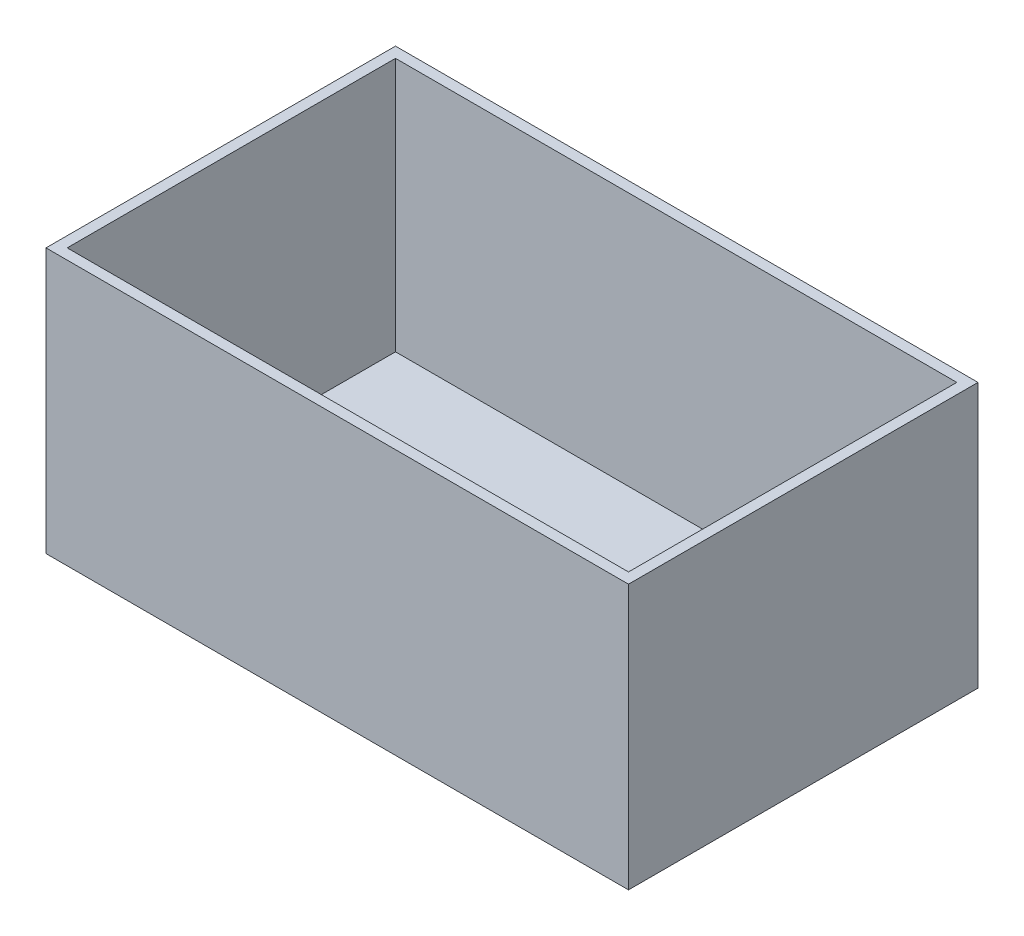
ISO-10303-21;
HEADER;
FILE_DESCRIPTION(('STEP AP214'),'2;1');
FILE_NAME('part.step','',(''),(''),'','','');
FILE_SCHEMA(('AUTOMOTIVE_DESIGN { 1 0 10303 214 1 1 1 1 }'));
ENDSEC;
DATA;
#1=APPLICATION_CONTEXT('core data for automotive mechanical design processes');
#2=APPLICATION_PROTOCOL_DEFINITION('international standard','automotive_design',2000,#1);
#3=PRODUCT_CONTEXT('',#1,'mechanical');
#4=PRODUCT('Part','Part','',(#3));
#5=PRODUCT_RELATED_PRODUCT_CATEGORY('part','',(#4));
#6=PRODUCT_DEFINITION_FORMATION('','',#4);
#7=PRODUCT_DEFINITION_CONTEXT('part definition',#1,'design');
#8=PRODUCT_DEFINITION('design','',#6,#7);
#9=PRODUCT_DEFINITION_SHAPE('','',#8);
#10=(LENGTH_UNIT() NAMED_UNIT(*) SI_UNIT(.MILLI.,.METRE.));
#11=(NAMED_UNIT(*) PLANE_ANGLE_UNIT() SI_UNIT($,.RADIAN.));
#12=(NAMED_UNIT(*) SI_UNIT($,.STERADIAN.) SOLID_ANGLE_UNIT());
#13=UNCERTAINTY_MEASURE_WITH_UNIT(LENGTH_MEASURE(1.E-05),#10,'distance_accuracy_value','');
#14=(GEOMETRIC_REPRESENTATION_CONTEXT(3) GLOBAL_UNCERTAINTY_ASSIGNED_CONTEXT((#13)) GLOBAL_UNIT_ASSIGNED_CONTEXT((#10,
#11,#12)) REPRESENTATION_CONTEXT('',''));
#15=CARTESIAN_POINT('',(0.,0.,0.));
#16=DIRECTION('',(0.,0.,1.));
#17=DIRECTION('',(1.,0.,0.));
#18=AXIS2_PLACEMENT_3D('',#15,#16,#17);
#19=CARTESIAN_POINT('',(349.25,-12.7,209.55));
#20=DIRECTION('',(0.,0.,-1.));
#21=DIRECTION('',(-1.,0.,0.));
#22=AXIS2_PLACEMENT_3D('',#19,#20,#21);
#23=PLANE('',#22);
#24=DIRECTION('',(0.,1.,0.));
#25=VECTOR('',#24,1.);
#26=CARTESIAN_POINT('',(349.25,-12.7,209.55));
#27=LINE('',#26,#25);
#28=CARTESIAN_POINT('',(349.25,-12.7,209.55));
#29=VERTEX_POINT('',#28);
#30=CARTESIAN_POINT('',(349.25,304.8,209.55));
#31=VERTEX_POINT('',#30);
#32=EDGE_CURVE('E54',#29,#31,#27,.T.);
#33=ORIENTED_EDGE('',*,*,#32,.T.);
#34=DIRECTION('',(1.,0.,0.));
#35=VECTOR('',#34,1.);
#36=CARTESIAN_POINT('',(349.25,304.8,209.55));
#37=LINE('',#36,#35);
#38=CARTESIAN_POINT('',(-349.25,304.8,209.55));
#39=VERTEX_POINT('',#38);
#40=EDGE_CURVE('E113',#39,#31,#37,.T.);
#41=ORIENTED_EDGE('',*,*,#40,.F.);
#42=DIRECTION('',(0.,1.,0.));
#43=VECTOR('',#42,1.);
#44=CARTESIAN_POINT('',(-349.25,-12.7,209.55));
#45=LINE('',#44,#43);
#46=CARTESIAN_POINT('',(-349.25,-12.7,209.55));
#47=VERTEX_POINT('',#46);
#48=EDGE_CURVE('E11',#47,#39,#45,.T.);
#49=ORIENTED_EDGE('',*,*,#48,.F.);
#50=DIRECTION('',(-1.,0.,0.));
#51=VECTOR('',#50,1.);
#52=CARTESIAN_POINT('',(349.25,-12.7,209.55));
#53=LINE('',#52,#51);
#54=EDGE_CURVE('E148',#29,#47,#53,.T.);
#55=ORIENTED_EDGE('',*,*,#54,.F.);
#56=EDGE_LOOP('',(#33,#41,#49,#55));
#57=FACE_BOUND('',#56,.T.);
#58=ADVANCED_FACE('F32',(#57),#23,.F.);
#59=CARTESIAN_POINT('',(-349.25,-12.7,209.55));
#60=DIRECTION('',(1.,0.,0.));
#61=DIRECTION('',(0.,0.,-1.));
#62=AXIS2_PLACEMENT_3D('',#59,#60,#61);
#63=PLANE('',#62);
#64=ORIENTED_EDGE('',*,*,#48,.T.);
#65=DIRECTION('',(0.,0.,1.));
#66=VECTOR('',#65,1.);
#67=CARTESIAN_POINT('',(-349.25,304.8,209.55));
#68=LINE('',#67,#66);
#69=CARTESIAN_POINT('',(-349.25,304.8,-209.55));
#70=VERTEX_POINT('',#69);
#71=EDGE_CURVE('E145',#70,#39,#68,.T.);
#72=ORIENTED_EDGE('',*,*,#71,.F.);
#73=DIRECTION('',(0.,1.,0.));
#74=VECTOR('',#73,1.);
#75=CARTESIAN_POINT('',(-349.25,-12.7,-209.55));
#76=LINE('',#75,#74);
#77=CARTESIAN_POINT('',(-349.25,-12.7,-209.55));
#78=VERTEX_POINT('',#77);
#79=EDGE_CURVE('E39',#78,#70,#76,.T.);
#80=ORIENTED_EDGE('',*,*,#79,.F.);
#81=DIRECTION('',(0.,0.,-1.));
#82=VECTOR('',#81,1.);
#83=CARTESIAN_POINT('',(-349.25,-12.7,209.55));
#84=LINE('',#83,#82);
#85=EDGE_CURVE('E151',#47,#78,#84,.T.);
#86=ORIENTED_EDGE('',*,*,#85,.F.);
#87=EDGE_LOOP('',(#64,#72,#80,#86));
#88=FACE_BOUND('',#87,.T.);
#89=ADVANCED_FACE('F169',(#88),#63,.F.);
#90=CARTESIAN_POINT('',(349.25,-12.7,-209.55));
#91=DIRECTION('',(0.,0.,-1.));
#92=DIRECTION('',(-1.,0.,0.));
#93=AXIS2_PLACEMENT_3D('',#90,#91,#92);
#94=PLANE('',#93);
#95=ORIENTED_EDGE('',*,*,#79,.T.);
#96=DIRECTION('',(-1.,0.,0.));
#97=VECTOR('',#96,1.);
#98=CARTESIAN_POINT('',(349.25,304.8,-209.55));
#99=LINE('',#98,#97);
#100=CARTESIAN_POINT('',(349.25,304.8,-209.55));
#101=VERTEX_POINT('',#100);
#102=EDGE_CURVE('E142',#101,#70,#99,.T.);
#103=ORIENTED_EDGE('',*,*,#102,.F.);
#104=DIRECTION('',(0.,1.,0.));
#105=VECTOR('',#104,1.);
#106=CARTESIAN_POINT('',(349.25,-12.7,-209.55));
#107=LINE('',#106,#105);
#108=CARTESIAN_POINT('',(349.25,-12.7,-209.55));
#109=VERTEX_POINT('',#108);
#110=EDGE_CURVE('E159',#109,#101,#107,.T.);
#111=ORIENTED_EDGE('',*,*,#110,.F.);
#112=DIRECTION('',(-1.,0.,0.));
#113=VECTOR('',#112,1.);
#114=CARTESIAN_POINT('',(349.25,-12.7,-209.55));
#115=LINE('',#114,#113);
#116=EDGE_CURVE('E153',#109,#78,#115,.T.);
#117=ORIENTED_EDGE('',*,*,#116,.T.);
#118=EDGE_LOOP('',(#95,#103,#111,#117));
#119=FACE_BOUND('',#118,.T.);
#120=ADVANCED_FACE('F163',(#119),#94,.T.);
#121=CARTESIAN_POINT('',(349.25,-12.7,209.55));
#122=DIRECTION('',(1.,0.,0.));
#123=DIRECTION('',(0.,0.,-1.));
#124=AXIS2_PLACEMENT_3D('',#121,#122,#123);
#125=PLANE('',#124);
#126=ORIENTED_EDGE('',*,*,#110,.T.);
#127=DIRECTION('',(0.,0.,-1.));
#128=VECTOR('',#127,1.);
#129=CARTESIAN_POINT('',(349.25,304.8,209.55));
#130=LINE('',#129,#128);
#131=EDGE_CURVE('E139',#31,#101,#130,.T.);
#132=ORIENTED_EDGE('',*,*,#131,.F.);
#133=ORIENTED_EDGE('',*,*,#32,.F.);
#134=DIRECTION('',(0.,0.,-1.));
#135=VECTOR('',#134,1.);
#136=CARTESIAN_POINT('',(349.25,-12.7,209.55));
#137=LINE('',#136,#135);
#138=EDGE_CURVE('E156',#29,#109,#137,.T.);
#139=ORIENTED_EDGE('',*,*,#138,.T.);
#140=EDGE_LOOP('',(#126,#132,#133,#139));
#141=FACE_BOUND('',#140,.T.);
#142=ADVANCED_FACE('F173',(#141),#125,.T.);
#143=CARTESIAN_POINT('',(0.,-12.7,0.));
#144=DIRECTION('',(0.,-1.,0.));
#145=DIRECTION('',(0.,0.,-1.));
#146=AXIS2_PLACEMENT_3D('',#143,#144,#145);
#147=PLANE('',#146);
#148=ORIENTED_EDGE('',*,*,#54,.T.);
#149=ORIENTED_EDGE('',*,*,#85,.T.);
#150=ORIENTED_EDGE('',*,*,#116,.F.);
#151=ORIENTED_EDGE('',*,*,#138,.F.);
#152=EDGE_LOOP('',(#148,#149,#150,#151));
#153=FACE_BOUND('',#152,.T.);
#154=ADVANCED_FACE('F175',(#153),#147,.T.);
#155=CARTESIAN_POINT('',(0.,304.8,0.));
#156=DIRECTION('',(0.,-1.,0.));
#157=DIRECTION('',(0.,0.,-1.));
#158=AXIS2_PLACEMENT_3D('',#155,#156,#157);
#159=PLANE('',#158);
#160=ORIENTED_EDGE('',*,*,#40,.T.);
#161=ORIENTED_EDGE('',*,*,#131,.T.);
#162=ORIENTED_EDGE('',*,*,#102,.T.);
#163=ORIENTED_EDGE('',*,*,#71,.T.);
#164=EDGE_LOOP('',(#160,#161,#162,#163));
#165=FACE_BOUND('',#164,.T.);
#166=DIRECTION('',(0.,0.,1.));
#167=VECTOR('',#166,1.);
#168=CARTESIAN_POINT('',(-336.55,304.8,196.85));
#169=LINE('',#168,#167);
#170=CARTESIAN_POINT('',(-336.55,304.8,-196.85));
#171=VERTEX_POINT('',#170);
#172=CARTESIAN_POINT('',(-336.55,304.8,196.85));
#173=VERTEX_POINT('',#172);
#174=EDGE_CURVE('E97',#171,#173,#169,.T.);
#175=ORIENTED_EDGE('',*,*,#174,.F.);
#176=DIRECTION('',(-1.,0.,0.));
#177=VECTOR('',#176,1.);
#178=CARTESIAN_POINT('',(336.55,304.8,-196.85));
#179=LINE('',#178,#177);
#180=CARTESIAN_POINT('',(336.55,304.8,-196.85));
#181=VERTEX_POINT('',#180);
#182=EDGE_CURVE('E121',#181,#171,#179,.T.);
#183=ORIENTED_EDGE('',*,*,#182,.F.);
#184=DIRECTION('',(0.,0.,-1.));
#185=VECTOR('',#184,1.);
#186=CARTESIAN_POINT('',(336.55,304.8,196.85));
#187=LINE('',#186,#185);
#188=CARTESIAN_POINT('',(336.55,304.8,196.85));
#189=VERTEX_POINT('',#188);
#190=EDGE_CURVE('E119',#189,#181,#187,.T.);
#191=ORIENTED_EDGE('',*,*,#190,.F.);
#192=DIRECTION('',(1.,0.,0.));
#193=VECTOR('',#192,1.);
#194=CARTESIAN_POINT('',(336.55,304.8,196.85));
#195=LINE('',#194,#193);
#196=EDGE_CURVE('E105',#173,#189,#195,.T.);
#197=ORIENTED_EDGE('',*,*,#196,.F.);
#198=EDGE_LOOP('',(#175,#183,#191,#197));
#199=FACE_BOUND('',#198,.T.);
#200=ADVANCED_FACE('F117',(#165,#199),#159,.F.);
#201=CARTESIAN_POINT('',(-336.55,304.8,196.85));
#202=DIRECTION('',(1.,0.,0.));
#203=DIRECTION('',(0.,0.,-1.));
#204=AXIS2_PLACEMENT_3D('',#201,#202,#203);
#205=PLANE('',#204);
#206=DIRECTION('',(0.,0.,1.));
#207=VECTOR('',#206,1.);
#208=CARTESIAN_POINT('',(-336.55,0.,196.85));
#209=LINE('',#208,#207);
#210=CARTESIAN_POINT('',(-336.55,0.,-196.85));
#211=VERTEX_POINT('',#210);
#212=CARTESIAN_POINT('',(-336.55,0.,196.85));
#213=VERTEX_POINT('',#212);
#214=EDGE_CURVE('E125',#211,#213,#209,.T.);
#215=ORIENTED_EDGE('',*,*,#214,.F.);
#216=DIRECTION('',(0.,-1.,0.));
#217=VECTOR('',#216,1.);
#218=CARTESIAN_POINT('',(-336.55,304.8,-196.85));
#219=LINE('',#218,#217);
#220=EDGE_CURVE('E46',#171,#211,#219,.T.);
#221=ORIENTED_EDGE('',*,*,#220,.F.);
#222=ORIENTED_EDGE('',*,*,#174,.T.);
#223=DIRECTION('',(0.,-1.,0.));
#224=VECTOR('',#223,1.);
#225=CARTESIAN_POINT('',(-336.55,304.8,196.85));
#226=LINE('',#225,#224);
#227=EDGE_CURVE('E100',#173,#213,#226,.T.);
#228=ORIENTED_EDGE('',*,*,#227,.T.);
#229=EDGE_LOOP('',(#215,#221,#222,#228));
#230=FACE_BOUND('',#229,.T.);
#231=ADVANCED_FACE('F99',(#230),#205,.T.);
#232=CARTESIAN_POINT('',(336.55,304.8,196.85));
#233=DIRECTION('',(0.,0.,-1.));
#234=DIRECTION('',(-1.,0.,0.));
#235=AXIS2_PLACEMENT_3D('',#232,#233,#234);
#236=PLANE('',#235);
#237=DIRECTION('',(1.,0.,0.));
#238=VECTOR('',#237,1.);
#239=CARTESIAN_POINT('',(336.55,0.,196.85));
#240=LINE('',#239,#238);
#241=CARTESIAN_POINT('',(336.55,0.,196.85));
#242=VERTEX_POINT('',#241);
#243=EDGE_CURVE('E112',#213,#242,#240,.T.);
#244=ORIENTED_EDGE('',*,*,#243,.F.);
#245=ORIENTED_EDGE('',*,*,#227,.F.);
#246=ORIENTED_EDGE('',*,*,#196,.T.);
#247=DIRECTION('',(0.,-1.,0.));
#248=VECTOR('',#247,1.);
#249=CARTESIAN_POINT('',(336.55,304.8,196.85));
#250=LINE('',#249,#248);
#251=EDGE_CURVE('E114',#189,#242,#250,.T.);
#252=ORIENTED_EDGE('',*,*,#251,.T.);
#253=EDGE_LOOP('',(#244,#245,#246,#252));
#254=FACE_BOUND('',#253,.T.);
#255=ADVANCED_FACE('F109',(#254),#236,.T.);
#256=CARTESIAN_POINT('',(336.55,304.8,196.85));
#257=DIRECTION('',(-1.,0.,0.));
#258=DIRECTION('',(0.,0.,1.));
#259=AXIS2_PLACEMENT_3D('',#256,#257,#258);
#260=PLANE('',#259);
#261=DIRECTION('',(0.,0.,-1.));
#262=VECTOR('',#261,1.);
#263=CARTESIAN_POINT('',(336.55,0.,196.85));
#264=LINE('',#263,#262);
#265=CARTESIAN_POINT('',(336.55,0.,-196.85));
#266=VERTEX_POINT('',#265);
#267=EDGE_CURVE('E128',#242,#266,#264,.T.);
#268=ORIENTED_EDGE('',*,*,#267,.F.);
#269=ORIENTED_EDGE('',*,*,#251,.F.);
#270=ORIENTED_EDGE('',*,*,#190,.T.);
#271=DIRECTION('',(0.,-1.,0.));
#272=VECTOR('',#271,1.);
#273=CARTESIAN_POINT('',(336.55,304.8,-196.85));
#274=LINE('',#273,#272);
#275=EDGE_CURVE('E134',#181,#266,#274,.T.);
#276=ORIENTED_EDGE('',*,*,#275,.T.);
#277=EDGE_LOOP('',(#268,#269,#270,#276));
#278=FACE_BOUND('',#277,.T.);
#279=ADVANCED_FACE('F200',(#278),#260,.T.);
#280=CARTESIAN_POINT('',(336.55,304.8,-196.85));
#281=DIRECTION('',(0.,0.,1.));
#282=DIRECTION('',(1.,0.,0.));
#283=AXIS2_PLACEMENT_3D('',#280,#281,#282);
#284=PLANE('',#283);
#285=DIRECTION('',(-1.,0.,0.));
#286=VECTOR('',#285,1.);
#287=CARTESIAN_POINT('',(336.55,0.,-196.85));
#288=LINE('',#287,#286);
#289=EDGE_CURVE('E106',#266,#211,#288,.T.);
#290=ORIENTED_EDGE('',*,*,#289,.F.);
#291=ORIENTED_EDGE('',*,*,#275,.F.);
#292=ORIENTED_EDGE('',*,*,#182,.T.);
#293=ORIENTED_EDGE('',*,*,#220,.T.);
#294=EDGE_LOOP('',(#290,#291,#292,#293));
#295=FACE_BOUND('',#294,.T.);
#296=ADVANCED_FACE('F195',(#295),#284,.T.);
#297=CARTESIAN_POINT('',(0.,0.,0.));
#298=DIRECTION('',(0.,-1.,0.));
#299=DIRECTION('',(0.,0.,-1.));
#300=AXIS2_PLACEMENT_3D('',#297,#298,#299);
#301=PLANE('',#300);
#302=ORIENTED_EDGE('',*,*,#289,.T.);
#303=ORIENTED_EDGE('',*,*,#214,.T.);
#304=ORIENTED_EDGE('',*,*,#243,.T.);
#305=ORIENTED_EDGE('',*,*,#267,.T.);
#306=EDGE_LOOP('',(#302,#303,#304,#305));
#307=FACE_BOUND('',#306,.T.);
#308=ADVANCED_FACE('F193',(#307),#301,.F.);
#309=CLOSED_SHELL('',(#58,#89,#120,#142,#154,#200,#231,#255,#279,#296,#308));
#310=MANIFOLD_SOLID_BREP('B2',#309);
#311=ADVANCED_BREP_SHAPE_REPRESENTATION('',(#18,#310),#14);
#312=SHAPE_DEFINITION_REPRESENTATION(#9,#311);
ENDSEC;
END-ISO-10303-21;
